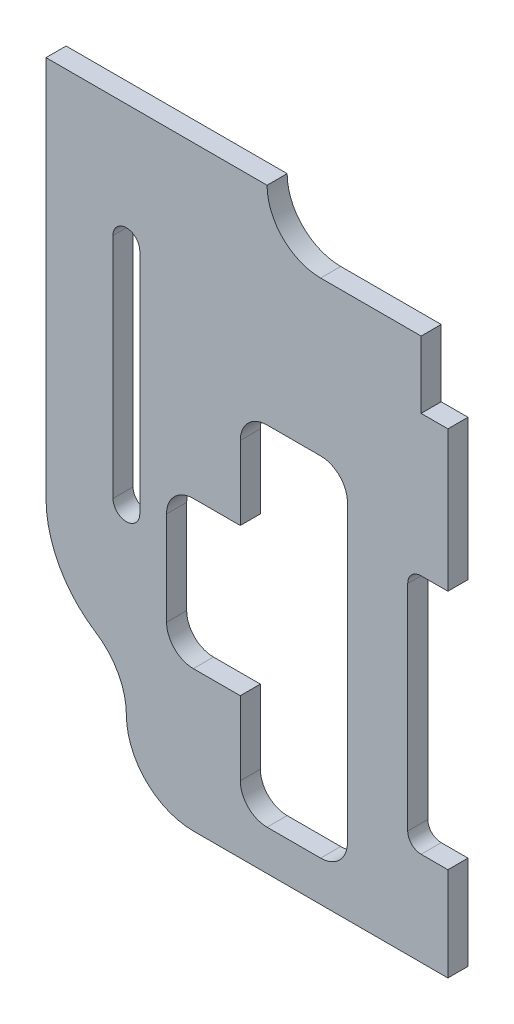
ISO-10303-21;
HEADER;
FILE_DESCRIPTION(('STEP AP214'),'2;1');
FILE_NAME('part.step','',(''),(''),'','','');
FILE_SCHEMA(('AUTOMOTIVE_DESIGN { 1 0 10303 214 1 1 1 1 }'));
ENDSEC;
DATA;
#1=APPLICATION_CONTEXT('core data for automotive mechanical design processes');
#2=APPLICATION_PROTOCOL_DEFINITION('international standard','automotive_design',2000,#1);
#3=PRODUCT_CONTEXT('',#1,'mechanical');
#4=PRODUCT('Part','Part','',(#3));
#5=PRODUCT_RELATED_PRODUCT_CATEGORY('part','',(#4));
#6=PRODUCT_DEFINITION_FORMATION('','',#4);
#7=PRODUCT_DEFINITION_CONTEXT('part definition',#1,'design');
#8=PRODUCT_DEFINITION('design','',#6,#7);
#9=PRODUCT_DEFINITION_SHAPE('','',#8);
#10=(LENGTH_UNIT() NAMED_UNIT(*) SI_UNIT(.MILLI.,.METRE.));
#11=(NAMED_UNIT(*) PLANE_ANGLE_UNIT() SI_UNIT($,.RADIAN.));
#12=(NAMED_UNIT(*) SI_UNIT($,.STERADIAN.) SOLID_ANGLE_UNIT());
#13=UNCERTAINTY_MEASURE_WITH_UNIT(LENGTH_MEASURE(1.E-05),#10,'distance_accuracy_value','');
#14=(GEOMETRIC_REPRESENTATION_CONTEXT(3) GLOBAL_UNCERTAINTY_ASSIGNED_CONTEXT((#13)) GLOBAL_UNIT_ASSIGNED_CONTEXT((#10,
#11,#12)) REPRESENTATION_CONTEXT('',''));
#15=CARTESIAN_POINT('',(0.,0.,0.));
#16=DIRECTION('',(0.,0.,1.));
#17=DIRECTION('',(1.,0.,0.));
#18=AXIS2_PLACEMENT_3D('',#15,#16,#17);
#19=CARTESIAN_POINT('',(-19.,5.,1.5));
#20=DIRECTION('',(0.,0.,1.));
#21=DIRECTION('',(1.,0.,0.));
#22=AXIS2_PLACEMENT_3D('',#19,#20,#21);
#23=PLANE('',#22);
#24=CARTESIAN_POINT('',(-19.,5.,1.5));
#25=DIRECTION('',(0.,0.,1.));
#26=DIRECTION('',(1.,0.,0.));
#27=AXIS2_PLACEMENT_3D('',#24,#25,#26);
#28=CIRCLE('',#27,5.);
#29=CARTESIAN_POINT('',(-24.,5.,1.5));
#30=VERTEX_POINT('',#29);
#31=CARTESIAN_POINT('',(-19.,0.,1.5));
#32=VERTEX_POINT('',#31);
#33=EDGE_CURVE('E397',#30,#32,#28,.T.);
#34=ORIENTED_EDGE('',*,*,#33,.T.);
#35=DIRECTION('',(1.,0.,0.));
#36=VECTOR('',#35,1.);
#37=CARTESIAN_POINT('',(-19.,0.,1.5));
#38=LINE('',#37,#36);
#39=CARTESIAN_POINT('',(0.,0.,1.5));
#40=VERTEX_POINT('',#39);
#41=EDGE_CURVE('E400',#32,#40,#38,.T.);
#42=ORIENTED_EDGE('',*,*,#41,.T.);
#43=DIRECTION('',(0.,1.,0.));
#44=VECTOR('',#43,1.);
#45=CARTESIAN_POINT('',(0.,0.,1.5));
#46=LINE('',#45,#44);
#47=CARTESIAN_POINT('',(0.,6.99999999999999,1.5));
#48=VERTEX_POINT('',#47);
#49=EDGE_CURVE('E403',#40,#48,#46,.T.);
#50=ORIENTED_EDGE('',*,*,#49,.T.);
#51=DIRECTION('',(-1.,0.,0.));
#52=VECTOR('',#51,1.);
#53=CARTESIAN_POINT('',(0.,6.99999999999999,1.5));
#54=LINE('',#53,#52);
#55=CARTESIAN_POINT('',(-2.,6.99999999999999,1.5));
#56=VERTEX_POINT('',#55);
#57=EDGE_CURVE('E405',#48,#56,#54,.T.);
#58=ORIENTED_EDGE('',*,*,#57,.T.);
#59=CARTESIAN_POINT('',(-2.,7.99999999999999,1.5));
#60=DIRECTION('',(0.,0.,-1.));
#61=DIRECTION('',(-1.,0.,0.));
#62=AXIS2_PLACEMENT_3D('',#59,#60,#61);
#63=CIRCLE('',#62,1.);
#64=CARTESIAN_POINT('',(-3.,7.99999999999999,1.5));
#65=VERTEX_POINT('',#64);
#66=EDGE_CURVE('E407',#56,#65,#63,.T.);
#67=ORIENTED_EDGE('',*,*,#66,.T.);
#68=DIRECTION('',(0.,1.,0.));
#69=VECTOR('',#68,1.);
#70=CARTESIAN_POINT('',(-3.,7.99999999999999,1.5));
#71=LINE('',#70,#69);
#72=CARTESIAN_POINT('',(-3.,24.,1.5));
#73=VERTEX_POINT('',#72);
#74=EDGE_CURVE('E409',#65,#73,#71,.T.);
#75=ORIENTED_EDGE('',*,*,#74,.T.);
#76=CARTESIAN_POINT('',(-2.,24.,1.5));
#77=DIRECTION('',(0.,0.,-1.));
#78=DIRECTION('',(-1.,0.,0.));
#79=AXIS2_PLACEMENT_3D('',#76,#77,#78);
#80=CIRCLE('',#79,1.);
#81=CARTESIAN_POINT('',(-2.,25.,1.5));
#82=VERTEX_POINT('',#81);
#83=EDGE_CURVE('E411',#73,#82,#80,.T.);
#84=ORIENTED_EDGE('',*,*,#83,.T.);
#85=DIRECTION('',(1.,0.,0.));
#86=VECTOR('',#85,1.);
#87=CARTESIAN_POINT('',(-2.,25.,1.5));
#88=LINE('',#87,#86);
#89=CARTESIAN_POINT('',(0.,25.,1.5));
#90=VERTEX_POINT('',#89);
#91=EDGE_CURVE('E413',#82,#90,#88,.T.);
#92=ORIENTED_EDGE('',*,*,#91,.T.);
#93=DIRECTION('',(0.,1.,0.));
#94=VECTOR('',#93,1.);
#95=CARTESIAN_POINT('',(0.,35.5,1.5));
#96=LINE('',#95,#94);
#97=CARTESIAN_POINT('',(0.,35.5,1.5));
#98=VERTEX_POINT('',#97);
#99=EDGE_CURVE('E415',#90,#98,#96,.T.);
#100=ORIENTED_EDGE('',*,*,#99,.T.);
#101=DIRECTION('',(-1.,0.,0.));
#102=VECTOR('',#101,1.);
#103=CARTESIAN_POINT('',(-2.,35.5,1.5));
#104=LINE('',#103,#102);
#105=CARTESIAN_POINT('',(-2.,35.5,1.5));
#106=VERTEX_POINT('',#105);
#107=EDGE_CURVE('E417',#98,#106,#104,.T.);
#108=ORIENTED_EDGE('',*,*,#107,.T.);
#109=DIRECTION('',(0.,1.,0.));
#110=VECTOR('',#109,1.);
#111=CARTESIAN_POINT('',(-2.,40.5,1.5));
#112=LINE('',#111,#110);
#113=CARTESIAN_POINT('',(-2.,40.5,1.5));
#114=VERTEX_POINT('',#113);
#115=EDGE_CURVE('E419',#106,#114,#112,.T.);
#116=ORIENTED_EDGE('',*,*,#115,.T.);
#117=DIRECTION('',(-1.,0.,0.));
#118=VECTOR('',#117,1.);
#119=CARTESIAN_POINT('',(-2.,40.5,1.5));
#120=LINE('',#119,#118);
#121=CARTESIAN_POINT('',(-9.5,40.5,1.5));
#122=VERTEX_POINT('',#121);
#123=EDGE_CURVE('E421',#114,#122,#120,.T.);
#124=ORIENTED_EDGE('',*,*,#123,.T.);
#125=CARTESIAN_POINT('',(-9.5,44.5,1.5));
#126=DIRECTION('',(0.,0.,-1.));
#127=DIRECTION('',(-1.,0.,0.));
#128=AXIS2_PLACEMENT_3D('',#125,#126,#127);
#129=CIRCLE('',#128,4.);
#130=CARTESIAN_POINT('',(-13.5,44.5,1.5));
#131=VERTEX_POINT('',#130);
#132=EDGE_CURVE('E423',#122,#131,#129,.T.);
#133=ORIENTED_EDGE('',*,*,#132,.T.);
#134=DIRECTION('',(-1.,0.,0.));
#135=VECTOR('',#134,1.);
#136=CARTESIAN_POINT('',(-13.5,44.5,1.5));
#137=LINE('',#136,#135);
#138=CARTESIAN_POINT('',(-30.,44.5,1.5));
#139=VERTEX_POINT('',#138);
#140=EDGE_CURVE('E425',#131,#139,#137,.T.);
#141=ORIENTED_EDGE('',*,*,#140,.T.);
#142=DIRECTION('',(0.,-1.,0.));
#143=VECTOR('',#142,1.);
#144=CARTESIAN_POINT('',(-30.,44.5,1.5));
#145=LINE('',#144,#143);
#146=CARTESIAN_POINT('',(-30.,16.,1.5));
#147=VERTEX_POINT('',#146);
#148=EDGE_CURVE('E427',#139,#147,#145,.T.);
#149=ORIENTED_EDGE('',*,*,#148,.T.);
#150=CARTESIAN_POINT('',(-21.9166666666667,16.,1.5));
#151=DIRECTION('',(0.,0.,1.));
#152=DIRECTION('',(1.,0.,0.));
#153=AXIS2_PLACEMENT_3D('',#150,#151,#152);
#154=CIRCLE('',#153,8.08333333333332);
#155=CARTESIAN_POINT('',(-26.2929936305732,9.20382165605096,1.5));
#156=VERTEX_POINT('',#155);
#157=EDGE_CURVE('E429',#147,#156,#154,.T.);
#158=ORIENTED_EDGE('',*,*,#157,.T.);
#159=CARTESIAN_POINT('',(-29.,5.,1.5));
#160=DIRECTION('',(0.,0.,-1.));
#161=DIRECTION('',(-1.,0.,0.));
#162=AXIS2_PLACEMENT_3D('',#159,#160,#161);
#163=CIRCLE('',#162,5.);
#164=EDGE_CURVE('E431',#156,#30,#163,.T.);
#165=ORIENTED_EDGE('',*,*,#164,.T.);
#166=EDGE_LOOP('',(#34,#42,#50,#58,#67,#75,#84,#92,#100,#108,#116,#124,#133,#141,#149,#158,#165));
#167=FACE_BOUND('',#166,.T.);
#168=DIRECTION('',(0.,-1.,0.));
#169=VECTOR('',#168,1.);
#170=CARTESIAN_POINT('',(-25.,35.5,1.5));
#171=LINE('',#170,#169);
#172=CARTESIAN_POINT('',(-25.,35.5,1.5));
#173=VERTEX_POINT('',#172);
#174=CARTESIAN_POINT('',(-25.,18.5,1.5));
#175=VERTEX_POINT('',#174);
#176=EDGE_CURVE('E368',#173,#175,#171,.T.);
#177=ORIENTED_EDGE('',*,*,#176,.F.);
#178=CARTESIAN_POINT('',(-24.,35.5,1.5));
#179=DIRECTION('',(0.,0.,1.));
#180=DIRECTION('',(1.,0.,0.));
#181=AXIS2_PLACEMENT_3D('',#178,#179,#180);
#182=CIRCLE('',#181,1.);
#183=CARTESIAN_POINT('',(-23.,35.5,1.5));
#184=VERTEX_POINT('',#183);
#185=EDGE_CURVE('E366',#184,#173,#182,.T.);
#186=ORIENTED_EDGE('',*,*,#185,.F.);
#187=DIRECTION('',(0.,1.,0.));
#188=VECTOR('',#187,1.);
#189=CARTESIAN_POINT('',(-23.,18.5,1.5));
#190=LINE('',#189,#188);
#191=CARTESIAN_POINT('',(-23.,18.5,1.5));
#192=VERTEX_POINT('',#191);
#193=EDGE_CURVE('E374',#192,#184,#190,.T.);
#194=ORIENTED_EDGE('',*,*,#193,.F.);
#195=CARTESIAN_POINT('',(-24.,18.5,1.5));
#196=DIRECTION('',(0.,0.,1.));
#197=DIRECTION('',(1.,0.,0.));
#198=AXIS2_PLACEMENT_3D('',#195,#196,#197);
#199=CIRCLE('',#198,0.999999999999999);
#200=EDGE_CURVE('E371',#175,#192,#199,.T.);
#201=ORIENTED_EDGE('',*,*,#200,.F.);
#202=EDGE_LOOP('',(#177,#186,#194,#201));
#203=FACE_BOUND('',#202,.T.);
#204=DIRECTION('',(0.,1.,0.));
#205=VECTOR('',#204,1.);
#206=CARTESIAN_POINT('',(-7.5,5.,1.5));
#207=LINE('',#206,#205);
#208=CARTESIAN_POINT('',(-7.5,5.,1.5));
#209=VERTEX_POINT('',#208);
#210=CARTESIAN_POINT('',(-7.5,27.,1.5));
#211=VERTEX_POINT('',#210);
#212=EDGE_CURVE('E267',#209,#211,#207,.T.);
#213=ORIENTED_EDGE('',*,*,#212,.F.);
#214=CARTESIAN_POINT('',(-9.5,5.,1.5));
#215=DIRECTION('',(0.,0.,1.));
#216=DIRECTION('',(-1.,0.,0.));
#217=AXIS2_PLACEMENT_3D('',#214,#215,#216);
#218=CIRCLE('',#217,2.);
#219=CARTESIAN_POINT('',(-9.5,3.,1.5));
#220=VERTEX_POINT('',#219);
#221=EDGE_CURVE('E259',#220,#209,#218,.T.);
#222=ORIENTED_EDGE('',*,*,#221,.F.);
#223=DIRECTION('',(1.,0.,0.));
#224=VECTOR('',#223,1.);
#225=CARTESIAN_POINT('',(-9.5,3.,1.5));
#226=LINE('',#225,#224);
#227=CARTESIAN_POINT('',(-13.5,3.,1.5));
#228=VERTEX_POINT('',#227);
#229=EDGE_CURVE('E304',#228,#220,#226,.T.);
#230=ORIENTED_EDGE('',*,*,#229,.F.);
#231=CARTESIAN_POINT('',(-13.5,5.,1.5));
#232=DIRECTION('',(0.,0.,1.));
#233=DIRECTION('',(1.,0.,0.));
#234=AXIS2_PLACEMENT_3D('',#231,#232,#233);
#235=CIRCLE('',#234,2.);
#236=CARTESIAN_POINT('',(-15.5,5.,1.5));
#237=VERTEX_POINT('',#236);
#238=EDGE_CURVE('E302',#237,#228,#235,.T.);
#239=ORIENTED_EDGE('',*,*,#238,.F.);
#240=DIRECTION('',(0.,-1.,0.));
#241=VECTOR('',#240,1.);
#242=CARTESIAN_POINT('',(-15.5,10.5,1.5));
#243=LINE('',#242,#241);
#244=CARTESIAN_POINT('',(-15.5,10.5,1.5));
#245=VERTEX_POINT('',#244);
#246=EDGE_CURVE('E300',#245,#237,#243,.T.);
#247=ORIENTED_EDGE('',*,*,#246,.F.);
#248=DIRECTION('',(1.,0.,0.));
#249=VECTOR('',#248,1.);
#250=CARTESIAN_POINT('',(-19.,10.5,1.5));
#251=LINE('',#250,#249);
#252=CARTESIAN_POINT('',(-19.,10.5,1.5));
#253=VERTEX_POINT('',#252);
#254=EDGE_CURVE('E298',#253,#245,#251,.T.);
#255=ORIENTED_EDGE('',*,*,#254,.F.);
#256=CARTESIAN_POINT('',(-19.,12.5,1.5));
#257=DIRECTION('',(0.,0.,1.));
#258=DIRECTION('',(1.,0.,0.));
#259=AXIS2_PLACEMENT_3D('',#256,#257,#258);
#260=CIRCLE('',#259,2.);
#261=CARTESIAN_POINT('',(-21.,12.5,1.5));
#262=VERTEX_POINT('',#261);
#263=EDGE_CURVE('E296',#262,#253,#260,.T.);
#264=ORIENTED_EDGE('',*,*,#263,.F.);
#265=DIRECTION('',(0.,-1.,0.));
#266=VECTOR('',#265,1.);
#267=CARTESIAN_POINT('',(-21.,19.5,1.5));
#268=LINE('',#267,#266);
#269=CARTESIAN_POINT('',(-21.,19.5,1.5));
#270=VERTEX_POINT('',#269);
#271=EDGE_CURVE('E294',#270,#262,#268,.T.);
#272=ORIENTED_EDGE('',*,*,#271,.F.);
#273=CARTESIAN_POINT('',(-19.,19.5,1.5));
#274=DIRECTION('',(0.,0.,1.));
#275=DIRECTION('',(1.,0.,0.));
#276=AXIS2_PLACEMENT_3D('',#273,#274,#275);
#277=CIRCLE('',#276,2.);
#278=CARTESIAN_POINT('',(-19.,21.5,1.5));
#279=VERTEX_POINT('',#278);
#280=EDGE_CURVE('E292',#279,#270,#277,.T.);
#281=ORIENTED_EDGE('',*,*,#280,.F.);
#282=DIRECTION('',(-1.,0.,0.));
#283=VECTOR('',#282,1.);
#284=CARTESIAN_POINT('',(-15.5,21.5,1.5));
#285=LINE('',#284,#283);
#286=CARTESIAN_POINT('',(-15.5,21.5,1.5));
#287=VERTEX_POINT('',#286);
#288=EDGE_CURVE('E290',#287,#279,#285,.T.);
#289=ORIENTED_EDGE('',*,*,#288,.F.);
#290=DIRECTION('',(0.,-1.,0.));
#291=VECTOR('',#290,1.);
#292=CARTESIAN_POINT('',(-15.5,27.,1.5));
#293=LINE('',#292,#291);
#294=CARTESIAN_POINT('',(-15.5,27.,1.5));
#295=VERTEX_POINT('',#294);
#296=EDGE_CURVE('E288',#295,#287,#293,.T.);
#297=ORIENTED_EDGE('',*,*,#296,.F.);
#298=CARTESIAN_POINT('',(-13.5,27.,1.5));
#299=DIRECTION('',(0.,0.,1.));
#300=DIRECTION('',(1.,0.,0.));
#301=AXIS2_PLACEMENT_3D('',#298,#299,#300);
#302=CIRCLE('',#301,2.);
#303=CARTESIAN_POINT('',(-13.5,29.,1.5));
#304=VERTEX_POINT('',#303);
#305=EDGE_CURVE('E286',#304,#295,#302,.T.);
#306=ORIENTED_EDGE('',*,*,#305,.F.);
#307=DIRECTION('',(-1.,0.,0.));
#308=VECTOR('',#307,1.);
#309=CARTESIAN_POINT('',(-9.5,29.,1.5));
#310=LINE('',#309,#308);
#311=CARTESIAN_POINT('',(-9.5,29.,1.5));
#312=VERTEX_POINT('',#311);
#313=EDGE_CURVE('E282',#312,#304,#310,.T.);
#314=ORIENTED_EDGE('',*,*,#313,.F.);
#315=CARTESIAN_POINT('',(-9.5,27.,1.5));
#316=DIRECTION('',(0.,0.,1.));
#317=DIRECTION('',(1.,0.,0.));
#318=AXIS2_PLACEMENT_3D('',#315,#316,#317);
#319=CIRCLE('',#318,2.);
#320=EDGE_CURVE('E280',#211,#312,#319,.T.);
#321=ORIENTED_EDGE('',*,*,#320,.F.);
#322=EDGE_LOOP('',(#213,#222,#230,#239,#247,#255,#264,#272,#281,#289,#297,#306,#314,#321));
#323=FACE_BOUND('',#322,.T.);
#324=ADVANCED_FACE('F32',(#167,#203,#323),#23,.T.);
#325=CARTESIAN_POINT('',(-19.,5.,0.));
#326=DIRECTION('',(0.,0.,1.));
#327=DIRECTION('',(1.,0.,0.));
#328=AXIS2_PLACEMENT_3D('',#325,#326,#327);
#329=PLANE('',#328);
#330=CARTESIAN_POINT('',(-24.,35.5,0.));
#331=DIRECTION('',(0.,0.,1.));
#332=DIRECTION('',(1.,0.,0.));
#333=AXIS2_PLACEMENT_3D('',#330,#331,#332);
#334=CIRCLE('',#333,1.);
#335=CARTESIAN_POINT('',(-23.,35.5,0.));
#336=VERTEX_POINT('',#335);
#337=CARTESIAN_POINT('',(-25.,35.5,0.));
#338=VERTEX_POINT('',#337);
#339=EDGE_CURVE('E275',#336,#338,#334,.T.);
#340=ORIENTED_EDGE('',*,*,#339,.T.);
#341=DIRECTION('',(0.,-1.,0.));
#342=VECTOR('',#341,1.);
#343=CARTESIAN_POINT('',(-25.,35.5,0.));
#344=LINE('',#343,#342);
#345=CARTESIAN_POINT('',(-25.,18.5,0.));
#346=VERTEX_POINT('',#345);
#347=EDGE_CURVE('E379',#338,#346,#344,.T.);
#348=ORIENTED_EDGE('',*,*,#347,.T.);
#349=CARTESIAN_POINT('',(-24.,18.5,0.));
#350=DIRECTION('',(0.,0.,1.));
#351=DIRECTION('',(1.,0.,0.));
#352=AXIS2_PLACEMENT_3D('',#349,#350,#351);
#353=CIRCLE('',#352,0.999999999999999);
#354=CARTESIAN_POINT('',(-23.,18.5,0.));
#355=VERTEX_POINT('',#354);
#356=EDGE_CURVE('E382',#346,#355,#353,.T.);
#357=ORIENTED_EDGE('',*,*,#356,.T.);
#358=DIRECTION('',(0.,1.,0.));
#359=VECTOR('',#358,1.);
#360=CARTESIAN_POINT('',(-23.,18.5,0.));
#361=LINE('',#360,#359);
#362=EDGE_CURVE('E369',#355,#336,#361,.T.);
#363=ORIENTED_EDGE('',*,*,#362,.T.);
#364=EDGE_LOOP('',(#340,#348,#357,#363));
#365=FACE_BOUND('',#364,.T.);
#366=CARTESIAN_POINT('',(-19.,5.,0.));
#367=DIRECTION('',(0.,0.,1.));
#368=DIRECTION('',(1.,0.,0.));
#369=AXIS2_PLACEMENT_3D('',#366,#367,#368);
#370=CIRCLE('',#369,5.);
#371=CARTESIAN_POINT('',(-24.,5.,0.));
#372=VERTEX_POINT('',#371);
#373=CARTESIAN_POINT('',(-19.,0.,0.));
#374=VERTEX_POINT('',#373);
#375=EDGE_CURVE('E396',#372,#374,#370,.T.);
#376=ORIENTED_EDGE('',*,*,#375,.F.);
#377=CARTESIAN_POINT('',(-29.,5.,0.));
#378=DIRECTION('',(0.,0.,-1.));
#379=DIRECTION('',(-1.,0.,0.));
#380=AXIS2_PLACEMENT_3D('',#377,#378,#379);
#381=CIRCLE('',#380,5.);
#382=CARTESIAN_POINT('',(-26.2929936305732,9.20382165605096,0.));
#383=VERTEX_POINT('',#382);
#384=EDGE_CURVE('E401',#383,#372,#381,.T.);
#385=ORIENTED_EDGE('',*,*,#384,.F.);
#386=CARTESIAN_POINT('',(-21.9166666666667,16.,0.));
#387=DIRECTION('',(0.,0.,1.));
#388=DIRECTION('',(1.,0.,0.));
#389=AXIS2_PLACEMENT_3D('',#386,#387,#388);
#390=CIRCLE('',#389,8.08333333333332);
#391=CARTESIAN_POINT('',(-30.,16.,0.));
#392=VERTEX_POINT('',#391);
#393=EDGE_CURVE('E464',#392,#383,#390,.T.);
#394=ORIENTED_EDGE('',*,*,#393,.F.);
#395=DIRECTION('',(0.,-1.,0.));
#396=VECTOR('',#395,1.);
#397=CARTESIAN_POINT('',(-30.,44.5,0.));
#398=LINE('',#397,#396);
#399=CARTESIAN_POINT('',(-30.,44.5,0.));
#400=VERTEX_POINT('',#399);
#401=EDGE_CURVE('E462',#400,#392,#398,.T.);
#402=ORIENTED_EDGE('',*,*,#401,.F.);
#403=DIRECTION('',(-1.,0.,0.));
#404=VECTOR('',#403,1.);
#405=CARTESIAN_POINT('',(-13.5,44.5,0.));
#406=LINE('',#405,#404);
#407=CARTESIAN_POINT('',(-13.5,44.5,0.));
#408=VERTEX_POINT('',#407);
#409=EDGE_CURVE('E460',#408,#400,#406,.T.);
#410=ORIENTED_EDGE('',*,*,#409,.F.);
#411=CARTESIAN_POINT('',(-9.5,44.5,0.));
#412=DIRECTION('',(0.,0.,-1.));
#413=DIRECTION('',(-1.,0.,0.));
#414=AXIS2_PLACEMENT_3D('',#411,#412,#413);
#415=CIRCLE('',#414,4.);
#416=CARTESIAN_POINT('',(-9.5,40.5,0.));
#417=VERTEX_POINT('',#416);
#418=EDGE_CURVE('E458',#417,#408,#415,.T.);
#419=ORIENTED_EDGE('',*,*,#418,.F.);
#420=DIRECTION('',(-1.,0.,0.));
#421=VECTOR('',#420,1.);
#422=CARTESIAN_POINT('',(-2.,40.5,0.));
#423=LINE('',#422,#421);
#424=CARTESIAN_POINT('',(-2.,40.5,0.));
#425=VERTEX_POINT('',#424);
#426=EDGE_CURVE('E456',#425,#417,#423,.T.);
#427=ORIENTED_EDGE('',*,*,#426,.F.);
#428=DIRECTION('',(0.,1.,0.));
#429=VECTOR('',#428,1.);
#430=CARTESIAN_POINT('',(-2.,40.5,0.));
#431=LINE('',#430,#429);
#432=CARTESIAN_POINT('',(-2.,35.5,0.));
#433=VERTEX_POINT('',#432);
#434=EDGE_CURVE('E454',#433,#425,#431,.T.);
#435=ORIENTED_EDGE('',*,*,#434,.F.);
#436=DIRECTION('',(-1.,0.,0.));
#437=VECTOR('',#436,1.);
#438=CARTESIAN_POINT('',(-2.,35.5,0.));
#439=LINE('',#438,#437);
#440=CARTESIAN_POINT('',(0.,35.5,0.));
#441=VERTEX_POINT('',#440);
#442=EDGE_CURVE('E452',#441,#433,#439,.T.);
#443=ORIENTED_EDGE('',*,*,#442,.F.);
#444=DIRECTION('',(0.,1.,0.));
#445=VECTOR('',#444,1.);
#446=CARTESIAN_POINT('',(0.,35.5,0.));
#447=LINE('',#446,#445);
#448=CARTESIAN_POINT('',(0.,25.,0.));
#449=VERTEX_POINT('',#448);
#450=EDGE_CURVE('E450',#449,#441,#447,.T.);
#451=ORIENTED_EDGE('',*,*,#450,.F.);
#452=DIRECTION('',(1.,0.,0.));
#453=VECTOR('',#452,1.);
#454=CARTESIAN_POINT('',(-2.,25.,0.));
#455=LINE('',#454,#453);
#456=CARTESIAN_POINT('',(-2.,25.,0.));
#457=VERTEX_POINT('',#456);
#458=EDGE_CURVE('E448',#457,#449,#455,.T.);
#459=ORIENTED_EDGE('',*,*,#458,.F.);
#460=CARTESIAN_POINT('',(-2.,24.,0.));
#461=DIRECTION('',(0.,0.,-1.));
#462=DIRECTION('',(-1.,0.,0.));
#463=AXIS2_PLACEMENT_3D('',#460,#461,#462);
#464=CIRCLE('',#463,1.);
#465=CARTESIAN_POINT('',(-3.,24.,0.));
#466=VERTEX_POINT('',#465);
#467=EDGE_CURVE('E446',#466,#457,#464,.T.);
#468=ORIENTED_EDGE('',*,*,#467,.F.);
#469=DIRECTION('',(0.,1.,0.));
#470=VECTOR('',#469,1.);
#471=CARTESIAN_POINT('',(-3.,7.99999999999999,0.));
#472=LINE('',#471,#470);
#473=CARTESIAN_POINT('',(-3.,7.99999999999999,0.));
#474=VERTEX_POINT('',#473);
#475=EDGE_CURVE('E444',#474,#466,#472,.T.);
#476=ORIENTED_EDGE('',*,*,#475,.F.);
#477=CARTESIAN_POINT('',(-2.,7.99999999999999,0.));
#478=DIRECTION('',(0.,0.,-1.));
#479=DIRECTION('',(-1.,0.,0.));
#480=AXIS2_PLACEMENT_3D('',#477,#478,#479);
#481=CIRCLE('',#480,1.);
#482=CARTESIAN_POINT('',(-2.,6.99999999999999,0.));
#483=VERTEX_POINT('',#482);
#484=EDGE_CURVE('E442',#483,#474,#481,.T.);
#485=ORIENTED_EDGE('',*,*,#484,.F.);
#486=DIRECTION('',(-1.,0.,0.));
#487=VECTOR('',#486,1.);
#488=CARTESIAN_POINT('',(0.,6.99999999999999,0.));
#489=LINE('',#488,#487);
#490=CARTESIAN_POINT('',(0.,6.99999999999999,0.));
#491=VERTEX_POINT('',#490);
#492=EDGE_CURVE('E440',#491,#483,#489,.T.);
#493=ORIENTED_EDGE('',*,*,#492,.F.);
#494=DIRECTION('',(0.,1.,0.));
#495=VECTOR('',#494,1.);
#496=CARTESIAN_POINT('',(0.,0.,0.));
#497=LINE('',#496,#495);
#498=CARTESIAN_POINT('',(0.,0.,0.));
#499=VERTEX_POINT('',#498);
#500=EDGE_CURVE('E438',#499,#491,#497,.T.);
#501=ORIENTED_EDGE('',*,*,#500,.F.);
#502=DIRECTION('',(1.,0.,0.));
#503=VECTOR('',#502,1.);
#504=CARTESIAN_POINT('',(-19.,0.,0.));
#505=LINE('',#504,#503);
#506=EDGE_CURVE('E436',#374,#499,#505,.T.);
#507=ORIENTED_EDGE('',*,*,#506,.F.);
#508=EDGE_LOOP('',(#376,#385,#394,#402,#410,#419,#427,#435,#443,#451,#459,#468,#476,#485,#493,
#501,#507));
#509=FACE_BOUND('',#508,.T.);
#510=CARTESIAN_POINT('',(-9.5,5.,0.));
#511=DIRECTION('',(0.,0.,1.));
#512=DIRECTION('',(-1.,0.,0.));
#513=AXIS2_PLACEMENT_3D('',#510,#511,#512);
#514=CIRCLE('',#513,2.);
#515=CARTESIAN_POINT('',(-9.5,3.,0.));
#516=VERTEX_POINT('',#515);
#517=CARTESIAN_POINT('',(-7.5,5.,0.));
#518=VERTEX_POINT('',#517);
#519=EDGE_CURVE('E55',#516,#518,#514,.T.);
#520=ORIENTED_EDGE('',*,*,#519,.T.);
#521=DIRECTION('',(0.,1.,0.));
#522=VECTOR('',#521,1.);
#523=CARTESIAN_POINT('',(-7.5,5.,0.));
#524=LINE('',#523,#522);
#525=CARTESIAN_POINT('',(-7.5,27.,0.));
#526=VERTEX_POINT('',#525);
#527=EDGE_CURVE('E274',#518,#526,#524,.T.);
#528=ORIENTED_EDGE('',*,*,#527,.T.);
#529=CARTESIAN_POINT('',(-9.5,27.,0.));
#530=DIRECTION('',(0.,0.,1.));
#531=DIRECTION('',(1.,0.,0.));
#532=AXIS2_PLACEMENT_3D('',#529,#530,#531);
#533=CIRCLE('',#532,2.);
#534=CARTESIAN_POINT('',(-9.5,29.,0.));
#535=VERTEX_POINT('',#534);
#536=EDGE_CURVE('E308',#526,#535,#533,.T.);
#537=ORIENTED_EDGE('',*,*,#536,.T.);
#538=DIRECTION('',(-1.,0.,0.));
#539=VECTOR('',#538,1.);
#540=CARTESIAN_POINT('',(-9.5,29.,0.));
#541=LINE('',#540,#539);
#542=CARTESIAN_POINT('',(-13.5,29.,0.));
#543=VERTEX_POINT('',#542);
#544=EDGE_CURVE('E311',#535,#543,#541,.T.);
#545=ORIENTED_EDGE('',*,*,#544,.T.);
#546=CARTESIAN_POINT('',(-13.5,27.,0.));
#547=DIRECTION('',(0.,0.,1.));
#548=DIRECTION('',(1.,0.,0.));
#549=AXIS2_PLACEMENT_3D('',#546,#547,#548);
#550=CIRCLE('',#549,2.);
#551=CARTESIAN_POINT('',(-15.5,27.,0.));
#552=VERTEX_POINT('',#551);
#553=EDGE_CURVE('E314',#543,#552,#550,.T.);
#554=ORIENTED_EDGE('',*,*,#553,.T.);
#555=DIRECTION('',(0.,-1.,0.));
#556=VECTOR('',#555,1.);
#557=CARTESIAN_POINT('',(-15.5,27.,0.));
#558=LINE('',#557,#556);
#559=CARTESIAN_POINT('',(-15.5,21.5,0.));
#560=VERTEX_POINT('',#559);
#561=EDGE_CURVE('E317',#552,#560,#558,.T.);
#562=ORIENTED_EDGE('',*,*,#561,.T.);
#563=DIRECTION('',(-1.,0.,0.));
#564=VECTOR('',#563,1.);
#565=CARTESIAN_POINT('',(-15.5,21.5,0.));
#566=LINE('',#565,#564);
#567=CARTESIAN_POINT('',(-19.,21.5,0.));
#568=VERTEX_POINT('',#567);
#569=EDGE_CURVE('E320',#560,#568,#566,.T.);
#570=ORIENTED_EDGE('',*,*,#569,.T.);
#571=CARTESIAN_POINT('',(-19.,19.5,0.));
#572=DIRECTION('',(0.,0.,1.));
#573=DIRECTION('',(1.,0.,0.));
#574=AXIS2_PLACEMENT_3D('',#571,#572,#573);
#575=CIRCLE('',#574,2.);
#576=CARTESIAN_POINT('',(-21.,19.5,0.));
#577=VERTEX_POINT('',#576);
#578=EDGE_CURVE('E323',#568,#577,#575,.T.);
#579=ORIENTED_EDGE('',*,*,#578,.T.);
#580=DIRECTION('',(0.,-1.,0.));
#581=VECTOR('',#580,1.);
#582=CARTESIAN_POINT('',(-21.,19.5,0.));
#583=LINE('',#582,#581);
#584=CARTESIAN_POINT('',(-21.,12.5,0.));
#585=VERTEX_POINT('',#584);
#586=EDGE_CURVE('E326',#577,#585,#583,.T.);
#587=ORIENTED_EDGE('',*,*,#586,.T.);
#588=CARTESIAN_POINT('',(-19.,12.5,0.));
#589=DIRECTION('',(0.,0.,1.));
#590=DIRECTION('',(1.,0.,0.));
#591=AXIS2_PLACEMENT_3D('',#588,#589,#590);
#592=CIRCLE('',#591,2.);
#593=CARTESIAN_POINT('',(-19.,10.5,0.));
#594=VERTEX_POINT('',#593);
#595=EDGE_CURVE('E329',#585,#594,#592,.T.);
#596=ORIENTED_EDGE('',*,*,#595,.T.);
#597=DIRECTION('',(1.,0.,0.));
#598=VECTOR('',#597,1.);
#599=CARTESIAN_POINT('',(-19.,10.5,0.));
#600=LINE('',#599,#598);
#601=CARTESIAN_POINT('',(-15.5,10.5,0.));
#602=VERTEX_POINT('',#601);
#603=EDGE_CURVE('E332',#594,#602,#600,.T.);
#604=ORIENTED_EDGE('',*,*,#603,.T.);
#605=DIRECTION('',(0.,-1.,0.));
#606=VECTOR('',#605,1.);
#607=CARTESIAN_POINT('',(-15.5,10.5,0.));
#608=LINE('',#607,#606);
#609=CARTESIAN_POINT('',(-15.5,5.,0.));
#610=VERTEX_POINT('',#609);
#611=EDGE_CURVE('E335',#602,#610,#608,.T.);
#612=ORIENTED_EDGE('',*,*,#611,.T.);
#613=CARTESIAN_POINT('',(-13.5,5.,0.));
#614=DIRECTION('',(0.,0.,1.));
#615=DIRECTION('',(1.,0.,0.));
#616=AXIS2_PLACEMENT_3D('',#613,#614,#615);
#617=CIRCLE('',#616,2.);
#618=CARTESIAN_POINT('',(-13.5,3.,0.));
#619=VERTEX_POINT('',#618);
#620=EDGE_CURVE('E338',#610,#619,#617,.T.);
#621=ORIENTED_EDGE('',*,*,#620,.T.);
#622=DIRECTION('',(1.,0.,0.));
#623=VECTOR('',#622,1.);
#624=CARTESIAN_POINT('',(-9.5,3.,0.));
#625=LINE('',#624,#623);
#626=EDGE_CURVE('E268',#619,#516,#625,.T.);
#627=ORIENTED_EDGE('',*,*,#626,.T.);
#628=EDGE_LOOP('',(#520,#528,#537,#545,#554,#562,#570,#579,#587,#596,#604,#612,#621,#627));
#629=FACE_BOUND('',#628,.T.);
#630=ADVANCED_FACE('F521',(#365,#509,#629),#329,.F.);
#631=CARTESIAN_POINT('',(-19.,5.,1.5));
#632=DIRECTION('',(0.,0.,-1.));
#633=DIRECTION('',(-1.,0.,0.));
#634=AXIS2_PLACEMENT_3D('',#631,#632,#633);
#635=CYLINDRICAL_SURFACE('',#634,5.);
#636=ORIENTED_EDGE('',*,*,#375,.T.);
#637=DIRECTION('',(0.,0.,-1.));
#638=VECTOR('',#637,1.);
#639=CARTESIAN_POINT('',(-19.,0.,1.5));
#640=LINE('',#639,#638);
#641=EDGE_CURVE('E11',#32,#374,#640,.T.);
#642=ORIENTED_EDGE('',*,*,#641,.F.);
#643=ORIENTED_EDGE('',*,*,#33,.F.);
#644=DIRECTION('',(0.,0.,-1.));
#645=VECTOR('',#644,1.);
#646=CARTESIAN_POINT('',(-24.,5.,1.5));
#647=LINE('',#646,#645);
#648=EDGE_CURVE('E433',#30,#372,#647,.T.);
#649=ORIENTED_EDGE('',*,*,#648,.T.);
#650=EDGE_LOOP('',(#636,#642,#643,#649));
#651=FACE_BOUND('',#650,.T.);
#652=ADVANCED_FACE('F34',(#651),#635,.T.);
#653=CARTESIAN_POINT('',(-19.,0.,1.5));
#654=DIRECTION('',(0.,1.,0.));
#655=DIRECTION('',(0.,0.,1.));
#656=AXIS2_PLACEMENT_3D('',#653,#654,#655);
#657=PLANE('',#656);
#658=ORIENTED_EDGE('',*,*,#506,.T.);
#659=DIRECTION('',(0.,0.,-1.));
#660=VECTOR('',#659,1.);
#661=CARTESIAN_POINT('',(0.,0.,1.5));
#662=LINE('',#661,#660);
#663=EDGE_CURVE('E40',#40,#499,#662,.T.);
#664=ORIENTED_EDGE('',*,*,#663,.F.);
#665=ORIENTED_EDGE('',*,*,#41,.F.);
#666=ORIENTED_EDGE('',*,*,#641,.T.);
#667=EDGE_LOOP('',(#658,#664,#665,#666));
#668=FACE_BOUND('',#667,.T.);
#669=ADVANCED_FACE('F539',(#668),#657,.F.);
#670=CARTESIAN_POINT('',(0.,0.,1.5));
#671=DIRECTION('',(-1.,0.,0.));
#672=DIRECTION('',(0.,-1.,0.));
#673=AXIS2_PLACEMENT_3D('',#670,#671,#672);
#674=PLANE('',#673);
#675=ORIENTED_EDGE('',*,*,#500,.T.);
#676=DIRECTION('',(0.,0.,-1.));
#677=VECTOR('',#676,1.);
#678=CARTESIAN_POINT('',(0.,6.99999999999999,1.5));
#679=LINE('',#678,#677);
#680=EDGE_CURVE('E508',#48,#491,#679,.T.);
#681=ORIENTED_EDGE('',*,*,#680,.F.);
#682=ORIENTED_EDGE('',*,*,#49,.F.);
#683=ORIENTED_EDGE('',*,*,#663,.T.);
#684=EDGE_LOOP('',(#675,#681,#682,#683));
#685=FACE_BOUND('',#684,.T.);
#686=ADVANCED_FACE('F515',(#685),#674,.F.);
#687=CARTESIAN_POINT('',(0.,6.99999999999999,1.5));
#688=DIRECTION('',(0.,-1.,0.));
#689=DIRECTION('',(1.,0.,0.));
#690=AXIS2_PLACEMENT_3D('',#687,#688,#689);
#691=PLANE('',#690);
#692=ORIENTED_EDGE('',*,*,#492,.T.);
#693=DIRECTION('',(0.,0.,-1.));
#694=VECTOR('',#693,1.);
#695=CARTESIAN_POINT('',(-2.,6.99999999999999,1.5));
#696=LINE('',#695,#694);
#697=EDGE_CURVE('E505',#56,#483,#696,.T.);
#698=ORIENTED_EDGE('',*,*,#697,.F.);
#699=ORIENTED_EDGE('',*,*,#57,.F.);
#700=ORIENTED_EDGE('',*,*,#680,.T.);
#701=EDGE_LOOP('',(#692,#698,#699,#700));
#702=FACE_BOUND('',#701,.T.);
#703=ADVANCED_FACE('F527',(#702),#691,.F.);
#704=CARTESIAN_POINT('',(-2.,7.99999999999999,1.5));
#705=DIRECTION('',(0.,0.,-1.));
#706=DIRECTION('',(-1.,0.,0.));
#707=AXIS2_PLACEMENT_3D('',#704,#705,#706);
#708=CYLINDRICAL_SURFACE('',#707,1.);
#709=ORIENTED_EDGE('',*,*,#484,.T.);
#710=DIRECTION('',(0.,0.,-1.));
#711=VECTOR('',#710,1.);
#712=CARTESIAN_POINT('',(-3.,7.99999999999999,1.5));
#713=LINE('',#712,#711);
#714=EDGE_CURVE('E502',#65,#474,#713,.T.);
#715=ORIENTED_EDGE('',*,*,#714,.F.);
#716=ORIENTED_EDGE('',*,*,#66,.F.);
#717=ORIENTED_EDGE('',*,*,#697,.T.);
#718=EDGE_LOOP('',(#709,#715,#716,#717));
#719=FACE_BOUND('',#718,.T.);
#720=ADVANCED_FACE('F531',(#719),#708,.F.);
#721=CARTESIAN_POINT('',(-3.,7.99999999999999,1.5));
#722=DIRECTION('',(-1.,0.,0.));
#723=DIRECTION('',(0.,0.,1.));
#724=AXIS2_PLACEMENT_3D('',#721,#722,#723);
#725=PLANE('',#724);
#726=ORIENTED_EDGE('',*,*,#475,.T.);
#727=DIRECTION('',(0.,0.,-1.));
#728=VECTOR('',#727,1.);
#729=CARTESIAN_POINT('',(-3.,24.,1.5));
#730=LINE('',#729,#728);
#731=EDGE_CURVE('E499',#73,#466,#730,.T.);
#732=ORIENTED_EDGE('',*,*,#731,.F.);
#733=ORIENTED_EDGE('',*,*,#74,.F.);
#734=ORIENTED_EDGE('',*,*,#714,.T.);
#735=EDGE_LOOP('',(#726,#732,#733,#734));
#736=FACE_BOUND('',#735,.T.);
#737=ADVANCED_FACE('F597',(#736),#725,.F.);
#738=CARTESIAN_POINT('',(-2.,24.,1.5));
#739=DIRECTION('',(0.,0.,-1.));
#740=DIRECTION('',(-1.,0.,0.));
#741=AXIS2_PLACEMENT_3D('',#738,#739,#740);
#742=CYLINDRICAL_SURFACE('',#741,1.);
#743=ORIENTED_EDGE('',*,*,#467,.T.);
#744=DIRECTION('',(0.,0.,-1.));
#745=VECTOR('',#744,1.);
#746=CARTESIAN_POINT('',(-2.,25.,1.5));
#747=LINE('',#746,#745);
#748=EDGE_CURVE('E496',#82,#457,#747,.T.);
#749=ORIENTED_EDGE('',*,*,#748,.F.);
#750=ORIENTED_EDGE('',*,*,#83,.F.);
#751=ORIENTED_EDGE('',*,*,#731,.T.);
#752=EDGE_LOOP('',(#743,#749,#750,#751));
#753=FACE_BOUND('',#752,.T.);
#754=ADVANCED_FACE('F595',(#753),#742,.F.);
#755=CARTESIAN_POINT('',(-2.,25.,1.5));
#756=DIRECTION('',(0.,1.,0.));
#757=DIRECTION('',(0.,0.,1.));
#758=AXIS2_PLACEMENT_3D('',#755,#756,#757);
#759=PLANE('',#758);
#760=ORIENTED_EDGE('',*,*,#458,.T.);
#761=DIRECTION('',(0.,0.,-1.));
#762=VECTOR('',#761,1.);
#763=CARTESIAN_POINT('',(0.,25.,1.5));
#764=LINE('',#763,#762);
#765=EDGE_CURVE('E493',#90,#449,#764,.T.);
#766=ORIENTED_EDGE('',*,*,#765,.F.);
#767=ORIENTED_EDGE('',*,*,#91,.F.);
#768=ORIENTED_EDGE('',*,*,#748,.T.);
#769=EDGE_LOOP('',(#760,#766,#767,#768));
#770=FACE_BOUND('',#769,.T.);
#771=ADVANCED_FACE('F590',(#770),#759,.F.);
#772=CARTESIAN_POINT('',(0.,35.5,1.5));
#773=DIRECTION('',(-1.,0.,0.));
#774=DIRECTION('',(0.,-1.,0.));
#775=AXIS2_PLACEMENT_3D('',#772,#773,#774);
#776=PLANE('',#775);
#777=ORIENTED_EDGE('',*,*,#450,.T.);
#778=DIRECTION('',(0.,0.,-1.));
#779=VECTOR('',#778,1.);
#780=CARTESIAN_POINT('',(0.,35.5,1.5));
#781=LINE('',#780,#779);
#782=EDGE_CURVE('E490',#98,#441,#781,.T.);
#783=ORIENTED_EDGE('',*,*,#782,.F.);
#784=ORIENTED_EDGE('',*,*,#99,.F.);
#785=ORIENTED_EDGE('',*,*,#765,.T.);
#786=EDGE_LOOP('',(#777,#783,#784,#785));
#787=FACE_BOUND('',#786,.T.);
#788=ADVANCED_FACE('F585',(#787),#776,.F.);
#789=CARTESIAN_POINT('',(-2.,35.5,1.5));
#790=DIRECTION('',(0.,-1.,0.));
#791=DIRECTION('',(0.,0.,-1.));
#792=AXIS2_PLACEMENT_3D('',#789,#790,#791);
#793=PLANE('',#792);
#794=ORIENTED_EDGE('',*,*,#442,.T.);
#795=DIRECTION('',(0.,0.,-1.));
#796=VECTOR('',#795,1.);
#797=CARTESIAN_POINT('',(-2.,35.5,1.5));
#798=LINE('',#797,#796);
#799=EDGE_CURVE('E487',#106,#433,#798,.T.);
#800=ORIENTED_EDGE('',*,*,#799,.F.);
#801=ORIENTED_EDGE('',*,*,#107,.F.);
#802=ORIENTED_EDGE('',*,*,#782,.T.);
#803=EDGE_LOOP('',(#794,#800,#801,#802));
#804=FACE_BOUND('',#803,.T.);
#805=ADVANCED_FACE('F581',(#804),#793,.F.);
#806=CARTESIAN_POINT('',(-2.,40.5,1.5));
#807=DIRECTION('',(-1.,0.,0.));
#808=DIRECTION('',(0.,-1.,0.));
#809=AXIS2_PLACEMENT_3D('',#806,#807,#808);
#810=PLANE('',#809);
#811=ORIENTED_EDGE('',*,*,#434,.T.);
#812=DIRECTION('',(0.,0.,-1.));
#813=VECTOR('',#812,1.);
#814=CARTESIAN_POINT('',(-2.,40.5,1.5));
#815=LINE('',#814,#813);
#816=EDGE_CURVE('E484',#114,#425,#815,.T.);
#817=ORIENTED_EDGE('',*,*,#816,.F.);
#818=ORIENTED_EDGE('',*,*,#115,.F.);
#819=ORIENTED_EDGE('',*,*,#799,.T.);
#820=EDGE_LOOP('',(#811,#817,#818,#819));
#821=FACE_BOUND('',#820,.T.);
#822=ADVANCED_FACE('F576',(#821),#810,.F.);
#823=CARTESIAN_POINT('',(-2.,40.5,1.5));
#824=DIRECTION('',(0.,-1.,0.));
#825=DIRECTION('',(0.,0.,-1.));
#826=AXIS2_PLACEMENT_3D('',#823,#824,#825);
#827=PLANE('',#826);
#828=ORIENTED_EDGE('',*,*,#426,.T.);
#829=DIRECTION('',(0.,0.,-1.));
#830=VECTOR('',#829,1.);
#831=CARTESIAN_POINT('',(-9.5,40.5,1.5));
#832=LINE('',#831,#830);
#833=EDGE_CURVE('E481',#122,#417,#832,.T.);
#834=ORIENTED_EDGE('',*,*,#833,.F.);
#835=ORIENTED_EDGE('',*,*,#123,.F.);
#836=ORIENTED_EDGE('',*,*,#816,.T.);
#837=EDGE_LOOP('',(#828,#834,#835,#836));
#838=FACE_BOUND('',#837,.T.);
#839=ADVANCED_FACE('F570',(#838),#827,.F.);
#840=CARTESIAN_POINT('',(-9.5,44.5,1.5));
#841=DIRECTION('',(0.,0.,-1.));
#842=DIRECTION('',(-1.,0.,0.));
#843=AXIS2_PLACEMENT_3D('',#840,#841,#842);
#844=CYLINDRICAL_SURFACE('',#843,4.);
#845=ORIENTED_EDGE('',*,*,#418,.T.);
#846=DIRECTION('',(0.,0.,-1.));
#847=VECTOR('',#846,1.);
#848=CARTESIAN_POINT('',(-13.5,44.5,1.5));
#849=LINE('',#848,#847);
#850=EDGE_CURVE('E478',#131,#408,#849,.T.);
#851=ORIENTED_EDGE('',*,*,#850,.F.);
#852=ORIENTED_EDGE('',*,*,#132,.F.);
#853=ORIENTED_EDGE('',*,*,#833,.T.);
#854=EDGE_LOOP('',(#845,#851,#852,#853));
#855=FACE_BOUND('',#854,.T.);
#856=ADVANCED_FACE('F566',(#855),#844,.F.);
#857=CARTESIAN_POINT('',(-13.5,44.5,1.5));
#858=DIRECTION('',(0.,-1.,0.));
#859=DIRECTION('',(0.,0.,-1.));
#860=AXIS2_PLACEMENT_3D('',#857,#858,#859);
#861=PLANE('',#860);
#862=ORIENTED_EDGE('',*,*,#409,.T.);
#863=DIRECTION('',(0.,0.,-1.));
#864=VECTOR('',#863,1.);
#865=CARTESIAN_POINT('',(-30.,44.5,1.5));
#866=LINE('',#865,#864);
#867=EDGE_CURVE('E475',#139,#400,#866,.T.);
#868=ORIENTED_EDGE('',*,*,#867,.F.);
#869=ORIENTED_EDGE('',*,*,#140,.F.);
#870=ORIENTED_EDGE('',*,*,#850,.T.);
#871=EDGE_LOOP('',(#862,#868,#869,#870));
#872=FACE_BOUND('',#871,.T.);
#873=ADVANCED_FACE('F561',(#872),#861,.F.);
#874=CARTESIAN_POINT('',(-30.,44.5,1.5));
#875=DIRECTION('',(1.,0.,0.));
#876=DIRECTION('',(0.,1.,0.));
#877=AXIS2_PLACEMENT_3D('',#874,#875,#876);
#878=PLANE('',#877);
#879=ORIENTED_EDGE('',*,*,#401,.T.);
#880=DIRECTION('',(0.,0.,-1.));
#881=VECTOR('',#880,1.);
#882=CARTESIAN_POINT('',(-30.,16.,1.5));
#883=LINE('',#882,#881);
#884=EDGE_CURVE('E472',#147,#392,#883,.T.);
#885=ORIENTED_EDGE('',*,*,#884,.F.);
#886=ORIENTED_EDGE('',*,*,#148,.F.);
#887=ORIENTED_EDGE('',*,*,#867,.T.);
#888=EDGE_LOOP('',(#879,#885,#886,#887));
#889=FACE_BOUND('',#888,.T.);
#890=ADVANCED_FACE('F555',(#889),#878,.F.);
#891=CARTESIAN_POINT('',(-21.9166666666667,16.,1.5));
#892=DIRECTION('',(0.,0.,-1.));
#893=DIRECTION('',(-1.,0.,0.));
#894=AXIS2_PLACEMENT_3D('',#891,#892,#893);
#895=CYLINDRICAL_SURFACE('',#894,8.08333333333332);
#896=ORIENTED_EDGE('',*,*,#393,.T.);
#897=DIRECTION('',(0.,0.,-1.));
#898=VECTOR('',#897,1.);
#899=CARTESIAN_POINT('',(-26.2929936305732,9.20382165605096,1.5));
#900=LINE('',#899,#898);
#901=EDGE_CURVE('E469',#156,#383,#900,.T.);
#902=ORIENTED_EDGE('',*,*,#901,.F.);
#903=ORIENTED_EDGE('',*,*,#157,.F.);
#904=ORIENTED_EDGE('',*,*,#884,.T.);
#905=EDGE_LOOP('',(#896,#902,#903,#904));
#906=FACE_BOUND('',#905,.T.);
#907=ADVANCED_FACE('F551',(#906),#895,.T.);
#908=CARTESIAN_POINT('',(-29.,5.,1.5));
#909=DIRECTION('',(0.,0.,-1.));
#910=DIRECTION('',(-1.,0.,0.));
#911=AXIS2_PLACEMENT_3D('',#908,#909,#910);
#912=CYLINDRICAL_SURFACE('',#911,5.);
#913=ORIENTED_EDGE('',*,*,#384,.T.);
#914=ORIENTED_EDGE('',*,*,#648,.F.);
#915=ORIENTED_EDGE('',*,*,#164,.F.);
#916=ORIENTED_EDGE('',*,*,#901,.T.);
#917=EDGE_LOOP('',(#913,#914,#915,#916));
#918=FACE_BOUND('',#917,.T.);
#919=ADVANCED_FACE('F546',(#918),#912,.F.);
#920=CARTESIAN_POINT('',(-24.,35.5,1.5));
#921=DIRECTION('',(0.,0.,-1.));
#922=DIRECTION('',(-1.,0.,0.));
#923=AXIS2_PLACEMENT_3D('',#920,#921,#922);
#924=CYLINDRICAL_SURFACE('',#923,1.);
#925=ORIENTED_EDGE('',*,*,#339,.F.);
#926=DIRECTION('',(0.,0.,-1.));
#927=VECTOR('',#926,1.);
#928=CARTESIAN_POINT('',(-23.,35.5,1.5));
#929=LINE('',#928,#927);
#930=EDGE_CURVE('E376',#184,#336,#929,.T.);
#931=ORIENTED_EDGE('',*,*,#930,.F.);
#932=ORIENTED_EDGE('',*,*,#185,.T.);
#933=DIRECTION('',(0.,0.,-1.));
#934=VECTOR('',#933,1.);
#935=CARTESIAN_POINT('',(-25.,35.5,1.5));
#936=LINE('',#935,#934);
#937=EDGE_CURVE('E393',#173,#338,#936,.T.);
#938=ORIENTED_EDGE('',*,*,#937,.T.);
#939=EDGE_LOOP('',(#925,#931,#932,#938));
#940=FACE_BOUND('',#939,.T.);
#941=ADVANCED_FACE('F614',(#940),#924,.F.);
#942=CARTESIAN_POINT('',(-25.,35.5,1.5));
#943=DIRECTION('',(1.,0.,0.));
#944=DIRECTION('',(0.,1.,0.));
#945=AXIS2_PLACEMENT_3D('',#942,#943,#944);
#946=PLANE('',#945);
#947=ORIENTED_EDGE('',*,*,#347,.F.);
#948=ORIENTED_EDGE('',*,*,#937,.F.);
#949=ORIENTED_EDGE('',*,*,#176,.T.);
#950=DIRECTION('',(0.,0.,-1.));
#951=VECTOR('',#950,1.);
#952=CARTESIAN_POINT('',(-25.,18.5,1.5));
#953=LINE('',#952,#951);
#954=EDGE_CURVE('E391',#175,#346,#953,.T.);
#955=ORIENTED_EDGE('',*,*,#954,.T.);
#956=EDGE_LOOP('',(#947,#948,#949,#955));
#957=FACE_BOUND('',#956,.T.);
#958=ADVANCED_FACE('F682',(#957),#946,.T.);
#959=CARTESIAN_POINT('',(-24.,18.5,1.5));
#960=DIRECTION('',(0.,0.,-1.));
#961=DIRECTION('',(-1.,0.,0.));
#962=AXIS2_PLACEMENT_3D('',#959,#960,#961);
#963=CYLINDRICAL_SURFACE('',#962,0.999999999999999);
#964=ORIENTED_EDGE('',*,*,#356,.F.);
#965=ORIENTED_EDGE('',*,*,#954,.F.);
#966=ORIENTED_EDGE('',*,*,#200,.T.);
#967=DIRECTION('',(0.,0.,-1.));
#968=VECTOR('',#967,1.);
#969=CARTESIAN_POINT('',(-23.,18.5,1.5));
#970=LINE('',#969,#968);
#971=EDGE_CURVE('E389',#192,#355,#970,.T.);
#972=ORIENTED_EDGE('',*,*,#971,.T.);
#973=EDGE_LOOP('',(#964,#965,#966,#972));
#974=FACE_BOUND('',#973,.T.);
#975=ADVANCED_FACE('F689',(#974),#963,.F.);
#976=CARTESIAN_POINT('',(-23.,18.5,1.5));
#977=DIRECTION('',(-1.,0.,0.));
#978=DIRECTION('',(0.,0.,1.));
#979=AXIS2_PLACEMENT_3D('',#976,#977,#978);
#980=PLANE('',#979);
#981=ORIENTED_EDGE('',*,*,#362,.F.);
#982=ORIENTED_EDGE('',*,*,#971,.F.);
#983=ORIENTED_EDGE('',*,*,#193,.T.);
#984=ORIENTED_EDGE('',*,*,#930,.T.);
#985=EDGE_LOOP('',(#981,#982,#983,#984));
#986=FACE_BOUND('',#985,.T.);
#987=ADVANCED_FACE('F696',(#986),#980,.T.);
#988=CARTESIAN_POINT('',(-9.5,5.,1.5));
#989=DIRECTION('',(0.,0.,-1.));
#990=DIRECTION('',(-1.,0.,0.));
#991=AXIS2_PLACEMENT_3D('',#988,#989,#990);
#992=CYLINDRICAL_SURFACE('',#991,2.);
#993=ORIENTED_EDGE('',*,*,#519,.F.);
#994=DIRECTION('',(0.,0.,-1.));
#995=VECTOR('',#994,1.);
#996=CARTESIAN_POINT('',(-9.5,3.,1.5));
#997=LINE('',#996,#995);
#998=EDGE_CURVE('E263',#220,#516,#997,.T.);
#999=ORIENTED_EDGE('',*,*,#998,.F.);
#1000=ORIENTED_EDGE('',*,*,#221,.T.);
#1001=DIRECTION('',(0.,0.,-1.));
#1002=VECTOR('',#1001,1.);
#1003=CARTESIAN_POINT('',(-7.5,5.,1.5));
#1004=LINE('',#1003,#1002);
#1005=EDGE_CURVE('E262',#209,#518,#1004,.T.);
#1006=ORIENTED_EDGE('',*,*,#1005,.T.);
#1007=EDGE_LOOP('',(#993,#999,#1000,#1006));
#1008=FACE_BOUND('',#1007,.T.);
#1009=ADVANCED_FACE('F261',(#1008),#992,.F.);
#1010=CARTESIAN_POINT('',(-7.5,5.,1.5));
#1011=DIRECTION('',(-1.,0.,0.));
#1012=DIRECTION('',(0.,0.,1.));
#1013=AXIS2_PLACEMENT_3D('',#1010,#1011,#1012);
#1014=PLANE('',#1013);
#1015=ORIENTED_EDGE('',*,*,#527,.F.);
#1016=ORIENTED_EDGE('',*,*,#1005,.F.);
#1017=ORIENTED_EDGE('',*,*,#212,.T.);
#1018=DIRECTION('',(0.,0.,-1.));
#1019=VECTOR('',#1018,1.);
#1020=CARTESIAN_POINT('',(-7.5,27.,1.5));
#1021=LINE('',#1020,#1019);
#1022=EDGE_CURVE('E276',#211,#526,#1021,.T.);
#1023=ORIENTED_EDGE('',*,*,#1022,.T.);
#1024=EDGE_LOOP('',(#1015,#1016,#1017,#1023));
#1025=FACE_BOUND('',#1024,.T.);
#1026=ADVANCED_FACE('F271',(#1025),#1014,.T.);
#1027=CARTESIAN_POINT('',(-9.5,27.,1.5));
#1028=DIRECTION('',(0.,0.,-1.));
#1029=DIRECTION('',(-1.,0.,0.));
#1030=AXIS2_PLACEMENT_3D('',#1027,#1028,#1029);
#1031=CYLINDRICAL_SURFACE('',#1030,2.);
#1032=ORIENTED_EDGE('',*,*,#536,.F.);
#1033=ORIENTED_EDGE('',*,*,#1022,.F.);
#1034=ORIENTED_EDGE('',*,*,#320,.T.);
#1035=DIRECTION('',(0.,0.,-1.));
#1036=VECTOR('',#1035,1.);
#1037=CARTESIAN_POINT('',(-9.5,29.,1.5));
#1038=LINE('',#1037,#1036);
#1039=EDGE_CURVE('E363',#312,#535,#1038,.T.);
#1040=ORIENTED_EDGE('',*,*,#1039,.T.);
#1041=EDGE_LOOP('',(#1032,#1033,#1034,#1040));
#1042=FACE_BOUND('',#1041,.T.);
#1043=ADVANCED_FACE('F717',(#1042),#1031,.F.);
#1044=CARTESIAN_POINT('',(-9.5,29.,1.5));
#1045=DIRECTION('',(0.,-1.,0.));
#1046=DIRECTION('',(0.,0.,-1.));
#1047=AXIS2_PLACEMENT_3D('',#1044,#1045,#1046);
#1048=PLANE('',#1047);
#1049=ORIENTED_EDGE('',*,*,#544,.F.);
#1050=ORIENTED_EDGE('',*,*,#1039,.F.);
#1051=ORIENTED_EDGE('',*,*,#313,.T.);
#1052=DIRECTION('',(0.,0.,-1.));
#1053=VECTOR('',#1052,1.);
#1054=CARTESIAN_POINT('',(-13.5,29.,1.5));
#1055=LINE('',#1054,#1053);
#1056=EDGE_CURVE('E361',#304,#543,#1055,.T.);
#1057=ORIENTED_EDGE('',*,*,#1056,.T.);
#1058=EDGE_LOOP('',(#1049,#1050,#1051,#1057));
#1059=FACE_BOUND('',#1058,.T.);
#1060=ADVANCED_FACE('F724',(#1059),#1048,.T.);
#1061=CARTESIAN_POINT('',(-13.5,27.,1.5));
#1062=DIRECTION('',(0.,0.,-1.));
#1063=DIRECTION('',(-1.,0.,0.));
#1064=AXIS2_PLACEMENT_3D('',#1061,#1062,#1063);
#1065=CYLINDRICAL_SURFACE('',#1064,2.);
#1066=ORIENTED_EDGE('',*,*,#553,.F.);
#1067=ORIENTED_EDGE('',*,*,#1056,.F.);
#1068=ORIENTED_EDGE('',*,*,#305,.T.);
#1069=DIRECTION('',(0.,0.,-1.));
#1070=VECTOR('',#1069,1.);
#1071=CARTESIAN_POINT('',(-15.5,27.,1.5));
#1072=LINE('',#1071,#1070);
#1073=EDGE_CURVE('E359',#295,#552,#1072,.T.);
#1074=ORIENTED_EDGE('',*,*,#1073,.T.);
#1075=EDGE_LOOP('',(#1066,#1067,#1068,#1074));
#1076=FACE_BOUND('',#1075,.T.);
#1077=ADVANCED_FACE('F732',(#1076),#1065,.F.);
#1078=CARTESIAN_POINT('',(-15.5,27.,1.5));
#1079=DIRECTION('',(1.,0.,0.));
#1080=DIRECTION('',(0.,1.,0.));
#1081=AXIS2_PLACEMENT_3D('',#1078,#1079,#1080);
#1082=PLANE('',#1081);
#1083=ORIENTED_EDGE('',*,*,#561,.F.);
#1084=ORIENTED_EDGE('',*,*,#1073,.F.);
#1085=ORIENTED_EDGE('',*,*,#296,.T.);
#1086=DIRECTION('',(0.,0.,-1.));
#1087=VECTOR('',#1086,1.);
#1088=CARTESIAN_POINT('',(-15.5,21.5,1.5));
#1089=LINE('',#1088,#1087);
#1090=EDGE_CURVE('E357',#287,#560,#1089,.T.);
#1091=ORIENTED_EDGE('',*,*,#1090,.T.);
#1092=EDGE_LOOP('',(#1083,#1084,#1085,#1091));
#1093=FACE_BOUND('',#1092,.T.);
#1094=ADVANCED_FACE('F740',(#1093),#1082,.T.);
#1095=CARTESIAN_POINT('',(-15.5,21.5,1.5));
#1096=DIRECTION('',(0.,-1.,0.));
#1097=DIRECTION('',(0.,0.,-1.));
#1098=AXIS2_PLACEMENT_3D('',#1095,#1096,#1097);
#1099=PLANE('',#1098);
#1100=ORIENTED_EDGE('',*,*,#569,.F.);
#1101=ORIENTED_EDGE('',*,*,#1090,.F.);
#1102=ORIENTED_EDGE('',*,*,#288,.T.);
#1103=DIRECTION('',(0.,0.,-1.));
#1104=VECTOR('',#1103,1.);
#1105=CARTESIAN_POINT('',(-19.,21.5,1.5));
#1106=LINE('',#1105,#1104);
#1107=EDGE_CURVE('E355',#279,#568,#1106,.T.);
#1108=ORIENTED_EDGE('',*,*,#1107,.T.);
#1109=EDGE_LOOP('',(#1100,#1101,#1102,#1108));
#1110=FACE_BOUND('',#1109,.T.);
#1111=ADVANCED_FACE('F748',(#1110),#1099,.T.);
#1112=CARTESIAN_POINT('',(-19.,19.5,1.5));
#1113=DIRECTION('',(0.,0.,-1.));
#1114=DIRECTION('',(-1.,0.,0.));
#1115=AXIS2_PLACEMENT_3D('',#1112,#1113,#1114);
#1116=CYLINDRICAL_SURFACE('',#1115,2.);
#1117=ORIENTED_EDGE('',*,*,#578,.F.);
#1118=ORIENTED_EDGE('',*,*,#1107,.F.);
#1119=ORIENTED_EDGE('',*,*,#280,.T.);
#1120=DIRECTION('',(0.,0.,-1.));
#1121=VECTOR('',#1120,1.);
#1122=CARTESIAN_POINT('',(-21.,19.5,1.5));
#1123=LINE('',#1122,#1121);
#1124=EDGE_CURVE('E353',#270,#577,#1123,.T.);
#1125=ORIENTED_EDGE('',*,*,#1124,.T.);
#1126=EDGE_LOOP('',(#1117,#1118,#1119,#1125));
#1127=FACE_BOUND('',#1126,.T.);
#1128=ADVANCED_FACE('F756',(#1127),#1116,.F.);
#1129=CARTESIAN_POINT('',(-21.,19.5,1.5));
#1130=DIRECTION('',(1.,0.,0.));
#1131=DIRECTION('',(0.,0.,-1.));
#1132=AXIS2_PLACEMENT_3D('',#1129,#1130,#1131);
#1133=PLANE('',#1132);
#1134=ORIENTED_EDGE('',*,*,#586,.F.);
#1135=ORIENTED_EDGE('',*,*,#1124,.F.);
#1136=ORIENTED_EDGE('',*,*,#271,.T.);
#1137=DIRECTION('',(0.,0.,-1.));
#1138=VECTOR('',#1137,1.);
#1139=CARTESIAN_POINT('',(-21.,12.5,1.5));
#1140=LINE('',#1139,#1138);
#1141=EDGE_CURVE('E351',#262,#585,#1140,.T.);
#1142=ORIENTED_EDGE('',*,*,#1141,.T.);
#1143=EDGE_LOOP('',(#1134,#1135,#1136,#1142));
#1144=FACE_BOUND('',#1143,.T.);
#1145=ADVANCED_FACE('F764',(#1144),#1133,.T.);
#1146=CARTESIAN_POINT('',(-19.,12.5,1.5));
#1147=DIRECTION('',(0.,0.,-1.));
#1148=DIRECTION('',(-1.,0.,0.));
#1149=AXIS2_PLACEMENT_3D('',#1146,#1147,#1148);
#1150=CYLINDRICAL_SURFACE('',#1149,2.);
#1151=ORIENTED_EDGE('',*,*,#595,.F.);
#1152=ORIENTED_EDGE('',*,*,#1141,.F.);
#1153=ORIENTED_EDGE('',*,*,#263,.T.);
#1154=DIRECTION('',(0.,0.,-1.));
#1155=VECTOR('',#1154,1.);
#1156=CARTESIAN_POINT('',(-19.,10.5,1.5));
#1157=LINE('',#1156,#1155);
#1158=EDGE_CURVE('E349',#253,#594,#1157,.T.);
#1159=ORIENTED_EDGE('',*,*,#1158,.T.);
#1160=EDGE_LOOP('',(#1151,#1152,#1153,#1159));
#1161=FACE_BOUND('',#1160,.T.);
#1162=ADVANCED_FACE('F772',(#1161),#1150,.F.);
#1163=CARTESIAN_POINT('',(-19.,10.5,1.5));
#1164=DIRECTION('',(0.,1.,0.));
#1165=DIRECTION('',(0.,0.,1.));
#1166=AXIS2_PLACEMENT_3D('',#1163,#1164,#1165);
#1167=PLANE('',#1166);
#1168=ORIENTED_EDGE('',*,*,#603,.F.);
#1169=ORIENTED_EDGE('',*,*,#1158,.F.);
#1170=ORIENTED_EDGE('',*,*,#254,.T.);
#1171=DIRECTION('',(0.,0.,-1.));
#1172=VECTOR('',#1171,1.);
#1173=CARTESIAN_POINT('',(-15.5,10.5,1.5));
#1174=LINE('',#1173,#1172);
#1175=EDGE_CURVE('E347',#245,#602,#1174,.T.);
#1176=ORIENTED_EDGE('',*,*,#1175,.T.);
#1177=EDGE_LOOP('',(#1168,#1169,#1170,#1176));
#1178=FACE_BOUND('',#1177,.T.);
#1179=ADVANCED_FACE('F780',(#1178),#1167,.T.);
#1180=CARTESIAN_POINT('',(-15.5,10.5,1.5));
#1181=DIRECTION('',(1.,0.,0.));
#1182=DIRECTION('',(0.,1.,0.));
#1183=AXIS2_PLACEMENT_3D('',#1180,#1181,#1182);
#1184=PLANE('',#1183);
#1185=ORIENTED_EDGE('',*,*,#611,.F.);
#1186=ORIENTED_EDGE('',*,*,#1175,.F.);
#1187=ORIENTED_EDGE('',*,*,#246,.T.);
#1188=DIRECTION('',(0.,0.,-1.));
#1189=VECTOR('',#1188,1.);
#1190=CARTESIAN_POINT('',(-15.5,5.,1.5));
#1191=LINE('',#1190,#1189);
#1192=EDGE_CURVE('E345',#237,#610,#1191,.T.);
#1193=ORIENTED_EDGE('',*,*,#1192,.T.);
#1194=EDGE_LOOP('',(#1185,#1186,#1187,#1193));
#1195=FACE_BOUND('',#1194,.T.);
#1196=ADVANCED_FACE('F788',(#1195),#1184,.T.);
#1197=CARTESIAN_POINT('',(-13.5,5.,1.5));
#1198=DIRECTION('',(0.,0.,-1.));
#1199=DIRECTION('',(-1.,0.,0.));
#1200=AXIS2_PLACEMENT_3D('',#1197,#1198,#1199);
#1201=CYLINDRICAL_SURFACE('',#1200,2.);
#1202=ORIENTED_EDGE('',*,*,#620,.F.);
#1203=ORIENTED_EDGE('',*,*,#1192,.F.);
#1204=ORIENTED_EDGE('',*,*,#238,.T.);
#1205=DIRECTION('',(0.,0.,-1.));
#1206=VECTOR('',#1205,1.);
#1207=CARTESIAN_POINT('',(-13.5,3.,1.5));
#1208=LINE('',#1207,#1206);
#1209=EDGE_CURVE('E47',#228,#619,#1208,.T.);
#1210=ORIENTED_EDGE('',*,*,#1209,.T.);
#1211=EDGE_LOOP('',(#1202,#1203,#1204,#1210));
#1212=FACE_BOUND('',#1211,.T.);
#1213=ADVANCED_FACE('F796',(#1212),#1201,.F.);
#1214=CARTESIAN_POINT('',(-9.5,3.,1.5));
#1215=DIRECTION('',(0.,1.,0.));
#1216=DIRECTION('',(-1.,0.,0.));
#1217=AXIS2_PLACEMENT_3D('',#1214,#1215,#1216);
#1218=PLANE('',#1217);
#1219=ORIENTED_EDGE('',*,*,#626,.F.);
#1220=ORIENTED_EDGE('',*,*,#1209,.F.);
#1221=ORIENTED_EDGE('',*,*,#229,.T.);
#1222=ORIENTED_EDGE('',*,*,#998,.T.);
#1223=EDGE_LOOP('',(#1219,#1220,#1221,#1222));
#1224=FACE_BOUND('',#1223,.T.);
#1225=ADVANCED_FACE('F804',(#1224),#1218,.T.);
#1226=CLOSED_SHELL('',(#324,#630,#652,#669,#686,#703,#720,#737,#754,#771,#788,#805,#822,#839,
#856,#873,#890,#907,#919,#941,#958,#975,#987,#1009,#1026,#1043,#1060,#1077,#1094,#1111,#1128,
#1145,#1162,#1179,#1196,#1213,#1225));
#1227=MANIFOLD_SOLID_BREP('B2',#1226);
#1228=ADVANCED_BREP_SHAPE_REPRESENTATION('',(#18,#1227),#14);
#1229=SHAPE_DEFINITION_REPRESENTATION(#9,#1228);
ENDSEC;
END-ISO-10303-21;
